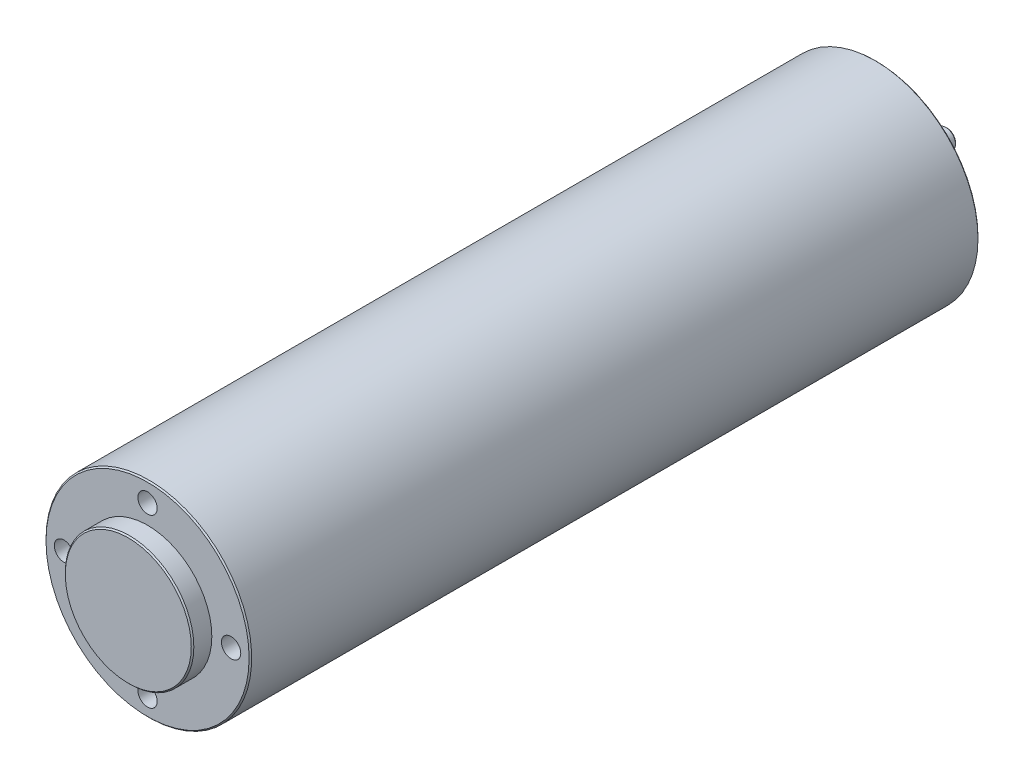
ISO-10303-21;
HEADER;
FILE_DESCRIPTION(('STEP AP214'),'2;1');
FILE_NAME('part.step','',(''),(''),'','','');
FILE_SCHEMA(('AUTOMOTIVE_DESIGN { 1 0 10303 214 1 1 1 1 }'));
ENDSEC;
DATA;
#1=APPLICATION_CONTEXT('core data for automotive mechanical design processes');
#2=APPLICATION_PROTOCOL_DEFINITION('international standard','automotive_design',2000,#1);
#3=PRODUCT_CONTEXT('',#1,'mechanical');
#4=PRODUCT('Part','Part','',(#3));
#5=PRODUCT_RELATED_PRODUCT_CATEGORY('part','',(#4));
#6=PRODUCT_DEFINITION_FORMATION('','',#4);
#7=PRODUCT_DEFINITION_CONTEXT('part definition',#1,'design');
#8=PRODUCT_DEFINITION('design','',#6,#7);
#9=PRODUCT_DEFINITION_SHAPE('','',#8);
#10=(LENGTH_UNIT() NAMED_UNIT(*) SI_UNIT(.MILLI.,.METRE.));
#11=(NAMED_UNIT(*) PLANE_ANGLE_UNIT() SI_UNIT($,.RADIAN.));
#12=(NAMED_UNIT(*) SI_UNIT($,.STERADIAN.) SOLID_ANGLE_UNIT());
#13=UNCERTAINTY_MEASURE_WITH_UNIT(LENGTH_MEASURE(1.E-05),#10,'distance_accuracy_value','');
#14=(GEOMETRIC_REPRESENTATION_CONTEXT(3) GLOBAL_UNCERTAINTY_ASSIGNED_CONTEXT((#13)) GLOBAL_UNIT_ASSIGNED_CONTEXT((#10,
#11,#12)) REPRESENTATION_CONTEXT('',''));
#15=CARTESIAN_POINT('',(0.,0.,0.));
#16=DIRECTION('',(0.,0.,1.));
#17=DIRECTION('',(1.,0.,0.));
#18=AXIS2_PLACEMENT_3D('',#15,#16,#17);
#19=CARTESIAN_POINT('',(0.,0.,113.4));
#20=DIRECTION('',(0.,0.,-1.));
#21=DIRECTION('',(-1.,0.,0.));
#22=AXIS2_PLACEMENT_3D('',#19,#20,#21);
#23=CYLINDRICAL_SURFACE('',#22,16.);
#24=CARTESIAN_POINT('',(0.,0.,113.2));
#25=DIRECTION('',(0.,0.,1.));
#26=DIRECTION('',(1.,0.,0.));
#27=AXIS2_PLACEMENT_3D('',#24,#25,#26);
#28=CIRCLE('',#27,16.);
#29=CARTESIAN_POINT('',(-16.,0.,113.2));
#30=VERTEX_POINT('',#29);
#31=EDGE_CURVE('E54',#30,#30,#28,.F.);
#32=CARTESIAN_POINT('',(0.,0.,0.200000000000117));
#33=DIRECTION('',(0.,0.,1.));
#34=DIRECTION('',(1.,0.,0.));
#35=AXIS2_PLACEMENT_3D('',#32,#33,#34);
#36=CIRCLE('',#35,16.);
#37=CARTESIAN_POINT('',(-16.,0.,0.200000000000103));
#38=VERTEX_POINT('',#37);
#39=EDGE_CURVE('E57',#38,#38,#36,.T.);
#40=CARTESIAN_POINT('',(-16.,0.,113.2));
#41=CARTESIAN_POINT('',(-16.,0.,112.022916666667));
#42=CARTESIAN_POINT('',(-16.,0.,110.845833333333));
#43=CARTESIAN_POINT('',(-16.,0.,108.491666666667));
#44=CARTESIAN_POINT('',(-16.,0.,107.314583333333));
#45=CARTESIAN_POINT('',(-16.,0.,104.960416666667));
#46=CARTESIAN_POINT('',(-16.,0.,103.783333333333));
#47=CARTESIAN_POINT('',(-16.,0.,101.429166666667));
#48=CARTESIAN_POINT('',(-16.,0.,100.252083333333));
#49=CARTESIAN_POINT('',(-16.,0.,97.8979166666667));
#50=CARTESIAN_POINT('',(-16.,0.,96.7208333333334));
#51=CARTESIAN_POINT('',(-16.,0.,94.3666666666667));
#52=CARTESIAN_POINT('',(-16.,0.,93.1895833333334));
#53=CARTESIAN_POINT('',(-16.,0.,90.8354166666667));
#54=CARTESIAN_POINT('',(-16.,0.,89.6583333333334));
#55=CARTESIAN_POINT('',(-16.,0.,87.3041666666667));
#56=CARTESIAN_POINT('',(-16.,0.,86.1270833333334));
#57=CARTESIAN_POINT('',(-16.,0.,83.7729166666667));
#58=CARTESIAN_POINT('',(-16.,0.,82.5958333333334));
#59=CARTESIAN_POINT('',(-16.,0.,80.2416666666667));
#60=CARTESIAN_POINT('',(-16.,0.,79.0645833333334));
#61=CARTESIAN_POINT('',(-16.,0.,76.7104166666667));
#62=CARTESIAN_POINT('',(-16.,0.,75.5333333333334));
#63=CARTESIAN_POINT('',(-16.,0.,73.1791666666667));
#64=CARTESIAN_POINT('',(-16.,0.,72.0020833333334));
#65=CARTESIAN_POINT('',(-16.,0.,69.6479166666667));
#66=CARTESIAN_POINT('',(-16.,0.,68.4708333333334));
#67=CARTESIAN_POINT('',(-16.,0.,66.1166666666667));
#68=CARTESIAN_POINT('',(-16.,0.,64.9395833333334));
#69=CARTESIAN_POINT('',(-16.,0.,62.5854166666667));
#70=CARTESIAN_POINT('',(-16.,0.,61.4083333333334));
#71=CARTESIAN_POINT('',(-16.,0.,59.0541666666667));
#72=CARTESIAN_POINT('',(-16.,0.,57.8770833333334));
#73=CARTESIAN_POINT('',(-16.,0.,55.5229166666667));
#74=CARTESIAN_POINT('',(-16.,0.,54.3458333333334));
#75=CARTESIAN_POINT('',(-16.,0.,51.9916666666667));
#76=CARTESIAN_POINT('',(-16.,0.,50.8145833333334));
#77=CARTESIAN_POINT('',(-16.,0.,48.4604166666667));
#78=CARTESIAN_POINT('',(-16.,0.,47.2833333333334));
#79=CARTESIAN_POINT('',(-16.,0.,44.9291666666668));
#80=CARTESIAN_POINT('',(-16.,0.,43.7520833333334));
#81=CARTESIAN_POINT('',(-16.,0.,41.3979166666667));
#82=CARTESIAN_POINT('',(-16.,0.,40.2208333333334));
#83=CARTESIAN_POINT('',(-16.,0.,37.8666666666668));
#84=CARTESIAN_POINT('',(-16.,0.,36.6895833333334));
#85=CARTESIAN_POINT('',(-16.,0.,34.3354166666668));
#86=CARTESIAN_POINT('',(-16.,0.,33.1583333333334));
#87=CARTESIAN_POINT('',(-16.,0.,30.8041666666668));
#88=CARTESIAN_POINT('',(-16.,0.,29.6270833333334));
#89=CARTESIAN_POINT('',(-16.,0.,27.2729166666668));
#90=CARTESIAN_POINT('',(-16.,0.,26.0958333333334));
#91=CARTESIAN_POINT('',(-16.,0.,23.7416666666668));
#92=CARTESIAN_POINT('',(-16.,0.,22.5645833333334));
#93=CARTESIAN_POINT('',(-16.,0.,20.2104166666668));
#94=CARTESIAN_POINT('',(-16.,0.,19.0333333333334));
#95=CARTESIAN_POINT('',(-16.,0.,16.6791666666668));
#96=CARTESIAN_POINT('',(-16.,0.,15.5020833333334));
#97=CARTESIAN_POINT('',(-16.,0.,13.1479166666668));
#98=CARTESIAN_POINT('',(-16.,0.,11.9708333333334));
#99=CARTESIAN_POINT('',(-16.,0.,9.61666666666678));
#100=CARTESIAN_POINT('',(-16.,0.,8.43958333333344));
#101=CARTESIAN_POINT('',(-16.,0.,6.08541666666677));
#102=CARTESIAN_POINT('',(-16.,0.,4.90833333333344));
#103=CARTESIAN_POINT('',(-16.,0.,2.55416666666678));
#104=CARTESIAN_POINT('',(-16.,0.,1.37708333333344));
#105=CARTESIAN_POINT('',(-16.,0.,0.200000000000103));
#106=B_SPLINE_CURVE_WITH_KNOTS('',3,(#40,#41,#42,#43,#44,#45,#46,#47,#48,#49,#50,#51,#52,#53,
#54,#55,#56,#57,#58,#59,#60,#61,#62,#63,#64,#65,#66,#67,#68,#69,#70,#71,#72,#73,#74,#75,#76,#77,
#78,#79,#80,#81,#82,#83,#84,#85,#86,#87,#88,#89,#90,#91,#92,#93,#94,#95,#96,#97,#98,#99,#100,
#101,#102,#103,#104,#105),.UNSPECIFIED.,.F.,.F.,(4,2,2,2,2,2,2,2,2,2,2,2,2,2,2,2,2,2,2,2,2,2,2,
2,2,2,2,2,2,2,2,2,4),(0.,3.53125,7.0625,10.59375,14.125,17.65625,21.1875,24.71875,28.25,
31.78125,35.3125,38.84375,42.375,45.90625,49.4375,52.96875,56.5,60.03125,63.5625,67.09375,
70.625,74.15625,77.6874999999999,81.21875,84.7499999999999,88.2812499999999,91.8124999999999,
95.3437499999999,98.8749999999999,102.40625,105.9375,109.46875,113.),.UNSPECIFIED.);
#107=EDGE_CURVE('BSEAM31',#30,#38,#106,.T.);
#108=ORIENTED_EDGE('',*,*,#31,.T.);
#109=ORIENTED_EDGE('',*,*,#39,.T.);
#110=ORIENTED_EDGE('',*,*,#107,.T.);
#111=ORIENTED_EDGE('',*,*,#107,.F.);
#112=EDGE_LOOP('',(#108,#110,#109,#111));
#113=FACE_BOUND('',#112,.T.);
#114=ADVANCED_FACE('F31',(#113),#23,.T.);
#115=CARTESIAN_POINT('',(0.,0.,113.4));
#116=DIRECTION('',(0.,0.,1.));
#117=DIRECTION('',(1.,0.,0.));
#118=AXIS2_PLACEMENT_3D('',#115,#116,#117);
#119=PLANE('',#118);
#120=CARTESIAN_POINT('',(0.,13.,113.4));
#121=DIRECTION('',(0.,0.,1.));
#122=DIRECTION('',(1.,0.,0.));
#123=AXIS2_PLACEMENT_3D('',#120,#121,#122);
#124=CIRCLE('',#123,1.5);
#125=CARTESIAN_POINT('',(1.5,13.,113.4));
#126=VERTEX_POINT('',#125);
#127=EDGE_CURVE('E97',#126,#126,#124,.T.);
#128=ORIENTED_EDGE('',*,*,#127,.F.);
#129=EDGE_LOOP('',(#128));
#130=FACE_BOUND('',#129,.T.);
#131=CARTESIAN_POINT('',(13.,0.,113.4));
#132=DIRECTION('',(0.,0.,1.));
#133=DIRECTION('',(1.,0.,0.));
#134=AXIS2_PLACEMENT_3D('',#131,#132,#133);
#135=CIRCLE('',#134,1.5);
#136=CARTESIAN_POINT('',(14.5,0.,113.4));
#137=VERTEX_POINT('',#136);
#138=EDGE_CURVE('E91',#137,#137,#135,.T.);
#139=ORIENTED_EDGE('',*,*,#138,.F.);
#140=EDGE_LOOP('',(#139));
#141=FACE_BOUND('',#140,.T.);
#142=CARTESIAN_POINT('',(0.,-13.,113.4));
#143=DIRECTION('',(0.,0.,1.));
#144=DIRECTION('',(1.,0.,0.));
#145=AXIS2_PLACEMENT_3D('',#142,#143,#144);
#146=CIRCLE('',#145,1.5);
#147=CARTESIAN_POINT('',(1.5,-13.,113.4));
#148=VERTEX_POINT('',#147);
#149=EDGE_CURVE('E85',#148,#148,#146,.T.);
#150=ORIENTED_EDGE('',*,*,#149,.F.);
#151=EDGE_LOOP('',(#150));
#152=FACE_BOUND('',#151,.T.);
#153=CARTESIAN_POINT('',(-13.,0.,113.4));
#154=DIRECTION('',(0.,0.,1.));
#155=DIRECTION('',(1.,0.,0.));
#156=AXIS2_PLACEMENT_3D('',#153,#154,#155);
#157=CIRCLE('',#156,1.5);
#158=CARTESIAN_POINT('',(-11.5,0.,113.4));
#159=VERTEX_POINT('',#158);
#160=EDGE_CURVE('E79',#159,#159,#157,.T.);
#161=ORIENTED_EDGE('',*,*,#160,.F.);
#162=EDGE_LOOP('',(#161));
#163=FACE_BOUND('',#162,.T.);
#164=CARTESIAN_POINT('',(0.,0.,113.4));
#165=DIRECTION('',(0.,0.,1.));
#166=DIRECTION('',(1.,0.,0.));
#167=AXIS2_PLACEMENT_3D('',#164,#165,#166);
#168=CIRCLE('',#167,15.8);
#169=CARTESIAN_POINT('',(15.8,0.,113.4));
#170=VERTEX_POINT('',#169);
#171=EDGE_CURVE('E60',#170,#170,#168,.T.);
#172=ORIENTED_EDGE('',*,*,#171,.T.);
#173=EDGE_LOOP('',(#172));
#174=FACE_BOUND('',#173,.T.);
#175=CARTESIAN_POINT('',(0.,0.,113.4));
#176=DIRECTION('',(0.,0.,1.));
#177=DIRECTION('',(1.,0.,0.));
#178=AXIS2_PLACEMENT_3D('',#175,#176,#177);
#179=CIRCLE('',#178,10.);
#180=CARTESIAN_POINT('',(10.,0.,113.4));
#181=VERTEX_POINT('',#180);
#182=EDGE_CURVE('E70',#181,#181,#179,.T.);
#183=ORIENTED_EDGE('',*,*,#182,.F.);
#184=EDGE_LOOP('',(#183));
#185=FACE_BOUND('',#184,.T.);
#186=ADVANCED_FACE('F112',(#130,#141,#152,#163,#174,#185),#119,.T.);
#187=CARTESIAN_POINT('',(0.,0.,0.));
#188=DIRECTION('',(0.,0.,1.));
#189=DIRECTION('',(1.,0.,0.));
#190=AXIS2_PLACEMENT_3D('',#187,#188,#189);
#191=PLANE('',#190);
#192=CARTESIAN_POINT('',(0.,0.,0.));
#193=DIRECTION('',(0.,0.,1.));
#194=DIRECTION('',(1.,0.,0.));
#195=AXIS2_PLACEMENT_3D('',#192,#193,#194);
#196=CIRCLE('',#195,15.7999999999999);
#197=CARTESIAN_POINT('',(15.7999999999999,0.,0.));
#198=VERTEX_POINT('',#197);
#199=EDGE_CURVE('E51',#198,#198,#196,.F.);
#200=ORIENTED_EDGE('',*,*,#199,.T.);
#201=EDGE_LOOP('',(#200));
#202=FACE_BOUND('',#201,.T.);
#203=CARTESIAN_POINT('',(0.,0.,0.));
#204=DIRECTION('',(0.,0.,-1.));
#205=DIRECTION('',(-1.,0.,0.));
#206=AXIS2_PLACEMENT_3D('',#203,#204,#205);
#207=CIRCLE('',#206,6.);
#208=CARTESIAN_POINT('',(-6.,0.,0.));
#209=VERTEX_POINT('',#208);
#210=EDGE_CURVE('E73',#209,#209,#207,.T.);
#211=ORIENTED_EDGE('',*,*,#210,.F.);
#212=EDGE_LOOP('',(#211));
#213=FACE_BOUND('',#212,.T.);
#214=ADVANCED_FACE('F115',(#202,#213),#191,.F.);
#215=CARTESIAN_POINT('',(0.,0.,116.4));
#216=DIRECTION('',(0.,0.,-1.));
#217=DIRECTION('',(-1.,0.,0.));
#218=AXIS2_PLACEMENT_3D('',#215,#216,#217);
#219=CYLINDRICAL_SURFACE('',#218,10.);
#220=CARTESIAN_POINT('',(0.,0.,116.2));
#221=DIRECTION('',(0.,0.,1.));
#222=DIRECTION('',(1.,0.,0.));
#223=AXIS2_PLACEMENT_3D('',#220,#221,#222);
#224=CIRCLE('',#223,10.);
#225=CARTESIAN_POINT('',(10.,0.,116.2));
#226=VERTEX_POINT('',#225);
#227=EDGE_CURVE('E63',#226,#226,#224,.F.);
#228=ORIENTED_EDGE('',*,*,#227,.T.);
#229=EDGE_LOOP('',(#228));
#230=FACE_BOUND('',#229,.T.);
#231=ORIENTED_EDGE('',*,*,#182,.T.);
#232=EDGE_LOOP('',(#231));
#233=FACE_BOUND('',#232,.T.);
#234=ADVANCED_FACE('F127',(#230,#233),#219,.T.);
#235=CARTESIAN_POINT('',(0.,0.,116.4));
#236=DIRECTION('',(0.,0.,1.));
#237=DIRECTION('',(1.,0.,0.));
#238=AXIS2_PLACEMENT_3D('',#235,#236,#237);
#239=PLANE('',#238);
#240=CARTESIAN_POINT('',(0.,0.,116.4));
#241=DIRECTION('',(0.,0.,1.));
#242=DIRECTION('',(1.,0.,0.));
#243=AXIS2_PLACEMENT_3D('',#240,#241,#242);
#244=CIRCLE('',#243,9.80000000000003);
#245=CARTESIAN_POINT('',(9.80000000000003,0.,116.4));
#246=VERTEX_POINT('',#245);
#247=EDGE_CURVE('E66',#246,#246,#244,.T.);
#248=ORIENTED_EDGE('',*,*,#247,.T.);
#249=EDGE_LOOP('',(#248));
#250=FACE_BOUND('',#249,.T.);
#251=ADVANCED_FACE('F129',(#250),#239,.T.);
#252=CARTESIAN_POINT('',(0.,0.,-2.));
#253=DIRECTION('',(0.,0.,1.));
#254=DIRECTION('',(1.,0.,0.));
#255=AXIS2_PLACEMENT_3D('',#252,#253,#254);
#256=CYLINDRICAL_SURFACE('',#255,6.);
#257=CARTESIAN_POINT('',(0.,0.,-1.8));
#258=DIRECTION('',(0.,0.,-1.));
#259=DIRECTION('',(-1.,0.,0.));
#260=AXIS2_PLACEMENT_3D('',#257,#258,#259);
#261=CIRCLE('',#260,6.);
#262=CARTESIAN_POINT('',(-6.,0.,-1.8));
#263=VERTEX_POINT('',#262);
#264=EDGE_CURVE('E42',#263,#263,#261,.F.);
#265=ORIENTED_EDGE('',*,*,#264,.T.);
#266=EDGE_LOOP('',(#265));
#267=FACE_BOUND('',#266,.T.);
#268=ORIENTED_EDGE('',*,*,#210,.T.);
#269=EDGE_LOOP('',(#268));
#270=FACE_BOUND('',#269,.T.);
#271=ADVANCED_FACE('F136',(#267,#270),#256,.T.);
#272=CARTESIAN_POINT('',(0.,0.,-2.));
#273=DIRECTION('',(0.,0.,-1.));
#274=DIRECTION('',(-1.,0.,0.));
#275=AXIS2_PLACEMENT_3D('',#272,#273,#274);
#276=PLANE('',#275);
#277=CARTESIAN_POINT('',(0.,0.,-2.));
#278=DIRECTION('',(0.,0.,-1.));
#279=DIRECTION('',(-1.,0.,0.));
#280=AXIS2_PLACEMENT_3D('',#277,#278,#279);
#281=CIRCLE('',#280,5.8);
#282=CARTESIAN_POINT('',(-5.8,0.,-2.));
#283=VERTEX_POINT('',#282);
#284=EDGE_CURVE('E46',#283,#283,#281,.T.);
#285=ORIENTED_EDGE('',*,*,#284,.T.);
#286=EDGE_LOOP('',(#285));
#287=FACE_BOUND('',#286,.T.);
#288=CARTESIAN_POINT('',(0.,0.,-2.));
#289=DIRECTION('',(0.,0.,-1.));
#290=DIRECTION('',(-1.,0.,0.));
#291=AXIS2_PLACEMENT_3D('',#288,#289,#290);
#292=CIRCLE('',#291,1.5);
#293=CARTESIAN_POINT('',(-1.5,0.,-2.));
#294=VERTEX_POINT('',#293);
#295=EDGE_CURVE('E69',#294,#294,#292,.T.);
#296=ORIENTED_EDGE('',*,*,#295,.F.);
#297=EDGE_LOOP('',(#296));
#298=FACE_BOUND('',#297,.T.);
#299=ADVANCED_FACE('F172',(#287,#298),#276,.T.);
#300=CARTESIAN_POINT('',(0.,0.,-11.));
#301=DIRECTION('',(0.,0.,1.));
#302=DIRECTION('',(1.,0.,0.));
#303=AXIS2_PLACEMENT_3D('',#300,#301,#302);
#304=CYLINDRICAL_SURFACE('',#303,1.5);
#305=CARTESIAN_POINT('',(0.,0.,-10.8));
#306=DIRECTION('',(0.,0.,-1.));
#307=DIRECTION('',(-1.,0.,0.));
#308=AXIS2_PLACEMENT_3D('',#305,#306,#307);
#309=CIRCLE('',#308,1.5);
#310=CARTESIAN_POINT('',(-1.5,0.,-10.8));
#311=VERTEX_POINT('',#310);
#312=EDGE_CURVE('E10',#311,#311,#309,.F.);
#313=ORIENTED_EDGE('',*,*,#312,.T.);
#314=EDGE_LOOP('',(#313));
#315=FACE_BOUND('',#314,.T.);
#316=ORIENTED_EDGE('',*,*,#295,.T.);
#317=EDGE_LOOP('',(#316));
#318=FACE_BOUND('',#317,.T.);
#319=ADVANCED_FACE('F175',(#315,#318),#304,.T.);
#320=CARTESIAN_POINT('',(0.,0.,-11.));
#321=DIRECTION('',(0.,0.,-1.));
#322=DIRECTION('',(-1.,0.,0.));
#323=AXIS2_PLACEMENT_3D('',#320,#321,#322);
#324=PLANE('',#323);
#325=CARTESIAN_POINT('',(0.,0.,-11.));
#326=DIRECTION('',(0.,0.,-1.));
#327=DIRECTION('',(-1.,0.,0.));
#328=AXIS2_PLACEMENT_3D('',#325,#326,#327);
#329=CIRCLE('',#328,1.3);
#330=CARTESIAN_POINT('',(-1.3,0.,-11.));
#331=VERTEX_POINT('',#330);
#332=EDGE_CURVE('E38',#331,#331,#329,.T.);
#333=ORIENTED_EDGE('',*,*,#332,.T.);
#334=EDGE_LOOP('',(#333));
#335=FACE_BOUND('',#334,.T.);
#336=ADVANCED_FACE('F152',(#335),#324,.T.);
#337=CARTESIAN_POINT('',(0.,0.,116.4));
#338=DIRECTION('',(0.,0.,-1.));
#339=DIRECTION('',(-1.,0.,0.));
#340=AXIS2_PLACEMENT_3D('',#337,#338,#339);
#341=CONICAL_SURFACE('',#340,9.80000000000003,0.785398163397396);
#342=ORIENTED_EDGE('',*,*,#227,.F.);
#343=EDGE_LOOP('',(#342));
#344=FACE_BOUND('',#343,.T.);
#345=ORIENTED_EDGE('',*,*,#247,.F.);
#346=EDGE_LOOP('',(#345));
#347=FACE_BOUND('',#346,.T.);
#348=ADVANCED_FACE('F148',(#344,#347),#341,.T.);
#349=CARTESIAN_POINT('',(0.,0.,113.4));
#350=DIRECTION('',(0.,0.,-1.));
#351=DIRECTION('',(-1.,0.,0.));
#352=AXIS2_PLACEMENT_3D('',#349,#350,#351);
#353=CONICAL_SURFACE('',#352,15.8,0.785398163397457);
#354=ORIENTED_EDGE('',*,*,#31,.F.);
#355=EDGE_LOOP('',(#354));
#356=FACE_BOUND('',#355,.T.);
#357=ORIENTED_EDGE('',*,*,#171,.F.);
#358=EDGE_LOOP('',(#357));
#359=FACE_BOUND('',#358,.T.);
#360=ADVANCED_FACE('F151',(#356,#359),#353,.T.);
#361=CARTESIAN_POINT('',(0.,0.,0.200000000000117));
#362=DIRECTION('',(0.,0.,1.));
#363=DIRECTION('',(1.,0.,0.));
#364=AXIS2_PLACEMENT_3D('',#361,#362,#363);
#365=CONICAL_SURFACE('',#364,16.,0.785398163397457);
#366=ORIENTED_EDGE('',*,*,#199,.F.);
#367=EDGE_LOOP('',(#366));
#368=FACE_BOUND('',#367,.T.);
#369=ORIENTED_EDGE('',*,*,#39,.F.);
#370=EDGE_LOOP('',(#369));
#371=FACE_BOUND('',#370,.T.);
#372=ADVANCED_FACE('F156',(#368,#371),#365,.T.);
#373=CARTESIAN_POINT('',(0.,0.,-2.));
#374=DIRECTION('',(0.,0.,1.));
#375=DIRECTION('',(1.,0.,0.));
#376=AXIS2_PLACEMENT_3D('',#373,#374,#375);
#377=CONICAL_SURFACE('',#376,5.8,0.785398163397438);
#378=ORIENTED_EDGE('',*,*,#264,.F.);
#379=EDGE_LOOP('',(#378));
#380=FACE_BOUND('',#379,.T.);
#381=ORIENTED_EDGE('',*,*,#284,.F.);
#382=EDGE_LOOP('',(#381));
#383=FACE_BOUND('',#382,.T.);
#384=ADVANCED_FACE('F159',(#380,#383),#377,.T.);
#385=CARTESIAN_POINT('',(0.,0.,-11.));
#386=DIRECTION('',(0.,0.,1.));
#387=DIRECTION('',(1.,0.,0.));
#388=AXIS2_PLACEMENT_3D('',#385,#386,#387);
#389=CONICAL_SURFACE('',#388,1.3,0.785398163397472);
#390=ORIENTED_EDGE('',*,*,#312,.F.);
#391=EDGE_LOOP('',(#390));
#392=FACE_BOUND('',#391,.T.);
#393=ORIENTED_EDGE('',*,*,#332,.F.);
#394=EDGE_LOOP('',(#393));
#395=FACE_BOUND('',#394,.T.);
#396=ADVANCED_FACE('F33',(#392,#395),#389,.T.);
#397=CARTESIAN_POINT('',(-13.,0.,109.4));
#398=DIRECTION('',(0.,0.,1.));
#399=DIRECTION('',(1.,0.,0.));
#400=AXIS2_PLACEMENT_3D('',#397,#398,#399);
#401=CYLINDRICAL_SURFACE('',#400,1.5);
#402=CARTESIAN_POINT('',(-13.,0.,109.4));
#403=DIRECTION('',(0.,0.,1.));
#404=DIRECTION('',(1.,0.,0.));
#405=AXIS2_PLACEMENT_3D('',#402,#403,#404);
#406=CIRCLE('',#405,1.5);
#407=CARTESIAN_POINT('',(-11.5,0.,109.4));
#408=VERTEX_POINT('',#407);
#409=EDGE_CURVE('E82',#408,#408,#406,.T.);
#410=ORIENTED_EDGE('',*,*,#409,.F.);
#411=EDGE_LOOP('',(#410));
#412=FACE_BOUND('',#411,.T.);
#413=ORIENTED_EDGE('',*,*,#160,.T.);
#414=EDGE_LOOP('',(#413));
#415=FACE_BOUND('',#414,.T.);
#416=ADVANCED_FACE('F166',(#412,#415),#401,.F.);
#417=CARTESIAN_POINT('',(-13.,0.,109.4));
#418=DIRECTION('',(0.,0.,1.));
#419=DIRECTION('',(1.,0.,0.));
#420=AXIS2_PLACEMENT_3D('',#417,#418,#419);
#421=PLANE('',#420);
#422=ORIENTED_EDGE('',*,*,#409,.T.);
#423=EDGE_LOOP('',(#422));
#424=FACE_BOUND('',#423,.T.);
#425=ADVANCED_FACE('F255',(#424),#421,.T.);
#426=CARTESIAN_POINT('',(0.,-13.,109.4));
#427=DIRECTION('',(0.,0.,1.));
#428=DIRECTION('',(1.,0.,0.));
#429=AXIS2_PLACEMENT_3D('',#426,#427,#428);
#430=CYLINDRICAL_SURFACE('',#429,1.5);
#431=CARTESIAN_POINT('',(0.,-13.,109.4));
#432=DIRECTION('',(0.,0.,1.));
#433=DIRECTION('',(1.,0.,0.));
#434=AXIS2_PLACEMENT_3D('',#431,#432,#433);
#435=CIRCLE('',#434,1.5);
#436=CARTESIAN_POINT('',(1.5,-13.,109.4));
#437=VERTEX_POINT('',#436);
#438=EDGE_CURVE('E88',#437,#437,#435,.T.);
#439=ORIENTED_EDGE('',*,*,#438,.F.);
#440=EDGE_LOOP('',(#439));
#441=FACE_BOUND('',#440,.T.);
#442=ORIENTED_EDGE('',*,*,#149,.T.);
#443=EDGE_LOOP('',(#442));
#444=FACE_BOUND('',#443,.T.);
#445=ADVANCED_FACE('F264',(#441,#444),#430,.F.);
#446=CARTESIAN_POINT('',(0.,-13.,109.4));
#447=DIRECTION('',(0.,0.,1.));
#448=DIRECTION('',(1.,0.,0.));
#449=AXIS2_PLACEMENT_3D('',#446,#447,#448);
#450=PLANE('',#449);
#451=ORIENTED_EDGE('',*,*,#438,.T.);
#452=EDGE_LOOP('',(#451));
#453=FACE_BOUND('',#452,.T.);
#454=ADVANCED_FACE('F274',(#453),#450,.T.);
#455=CARTESIAN_POINT('',(13.,0.,109.4));
#456=DIRECTION('',(0.,0.,1.));
#457=DIRECTION('',(1.,0.,0.));
#458=AXIS2_PLACEMENT_3D('',#455,#456,#457);
#459=CYLINDRICAL_SURFACE('',#458,1.5);
#460=CARTESIAN_POINT('',(13.,0.,109.4));
#461=DIRECTION('',(0.,0.,1.));
#462=DIRECTION('',(1.,0.,0.));
#463=AXIS2_PLACEMENT_3D('',#460,#461,#462);
#464=CIRCLE('',#463,1.5);
#465=CARTESIAN_POINT('',(14.5,0.,109.4));
#466=VERTEX_POINT('',#465);
#467=EDGE_CURVE('E94',#466,#466,#464,.T.);
#468=ORIENTED_EDGE('',*,*,#467,.F.);
#469=EDGE_LOOP('',(#468));
#470=FACE_BOUND('',#469,.T.);
#471=ORIENTED_EDGE('',*,*,#138,.T.);
#472=EDGE_LOOP('',(#471));
#473=FACE_BOUND('',#472,.T.);
#474=ADVANCED_FACE('F284',(#470,#473),#459,.F.);
#475=CARTESIAN_POINT('',(13.,0.,109.4));
#476=DIRECTION('',(0.,0.,1.));
#477=DIRECTION('',(1.,0.,0.));
#478=AXIS2_PLACEMENT_3D('',#475,#476,#477);
#479=PLANE('',#478);
#480=ORIENTED_EDGE('',*,*,#467,.T.);
#481=EDGE_LOOP('',(#480));
#482=FACE_BOUND('',#481,.T.);
#483=ADVANCED_FACE('F108',(#482),#479,.T.);
#484=CARTESIAN_POINT('',(0.,13.,109.4));
#485=DIRECTION('',(0.,0.,1.));
#486=DIRECTION('',(1.,0.,0.));
#487=AXIS2_PLACEMENT_3D('',#484,#485,#486);
#488=CYLINDRICAL_SURFACE('',#487,1.5);
#489=CARTESIAN_POINT('',(0.,13.,109.4));
#490=DIRECTION('',(0.,0.,1.));
#491=DIRECTION('',(1.,0.,0.));
#492=AXIS2_PLACEMENT_3D('',#489,#490,#491);
#493=CIRCLE('',#492,1.5);
#494=CARTESIAN_POINT('',(1.5,13.,109.4));
#495=VERTEX_POINT('',#494);
#496=EDGE_CURVE('E74',#495,#495,#493,.T.);
#497=ORIENTED_EDGE('',*,*,#496,.F.);
#498=EDGE_LOOP('',(#497));
#499=FACE_BOUND('',#498,.T.);
#500=ORIENTED_EDGE('',*,*,#127,.T.);
#501=EDGE_LOOP('',(#500));
#502=FACE_BOUND('',#501,.T.);
#503=ADVANCED_FACE('F105',(#499,#502),#488,.F.);
#504=CARTESIAN_POINT('',(0.,13.,109.4));
#505=DIRECTION('',(0.,0.,1.));
#506=DIRECTION('',(1.,0.,0.));
#507=AXIS2_PLACEMENT_3D('',#504,#505,#506);
#508=PLANE('',#507);
#509=ORIENTED_EDGE('',*,*,#496,.T.);
#510=EDGE_LOOP('',(#509));
#511=FACE_BOUND('',#510,.T.);
#512=ADVANCED_FACE('F103',(#511),#508,.T.);
#513=CLOSED_SHELL('',(#114,#186,#214,#234,#251,#271,#299,#319,#336,#348,#360,#372,#384,#396,
#416,#425,#445,#454,#474,#483,#503,#512));
#514=MANIFOLD_SOLID_BREP('B2',#513);
#515=ADVANCED_BREP_SHAPE_REPRESENTATION('',(#18,#514),#14);
#516=SHAPE_DEFINITION_REPRESENTATION(#9,#515);
ENDSEC;
END-ISO-10303-21;
